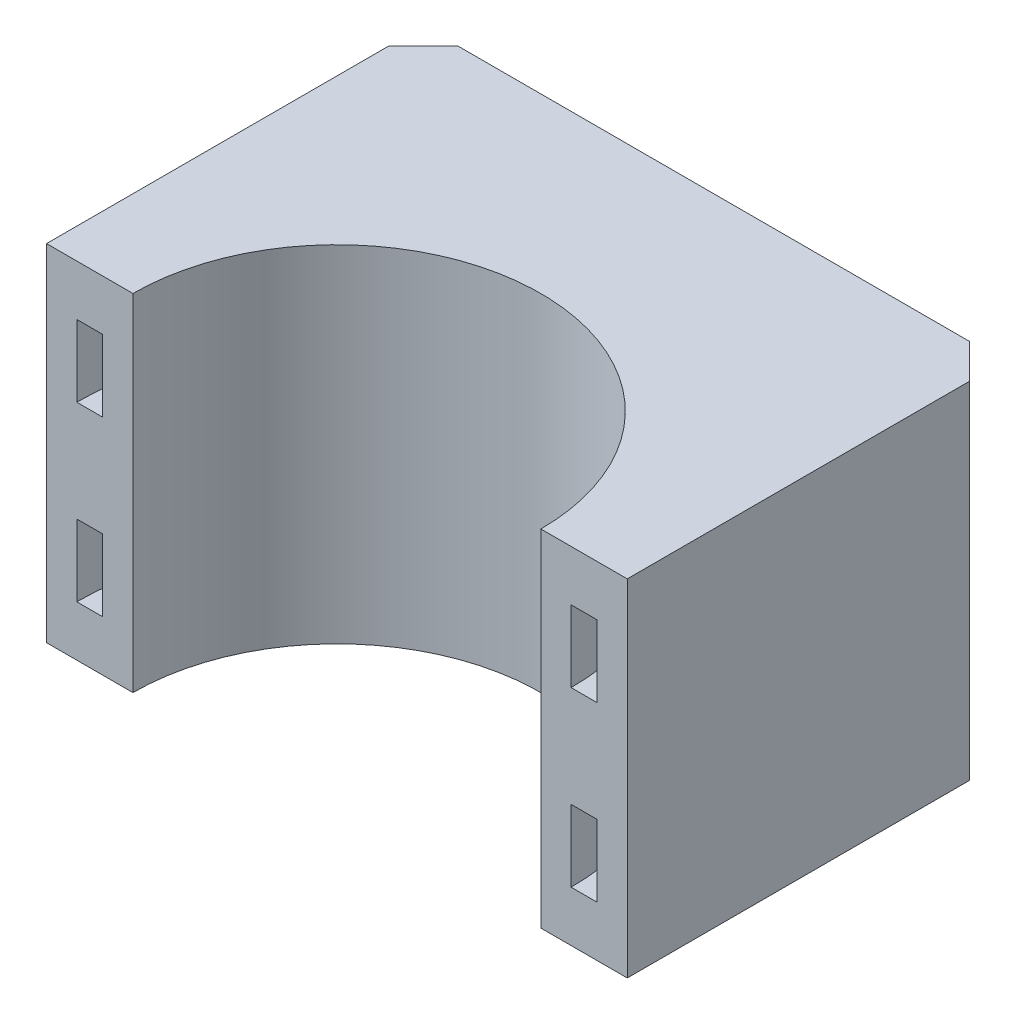
ISO-10303-21;
HEADER;
FILE_DESCRIPTION(('STEP AP214'),'2;1');
FILE_NAME('part.step','',(''),(''),'','','');
FILE_SCHEMA(('AUTOMOTIVE_DESIGN { 1 0 10303 214 1 1 1 1 }'));
ENDSEC;
DATA;
#1=APPLICATION_CONTEXT('core data for automotive mechanical design processes');
#2=APPLICATION_PROTOCOL_DEFINITION('international standard','automotive_design',2000,#1);
#3=PRODUCT_CONTEXT('',#1,'mechanical');
#4=PRODUCT('Part','Part','',(#3));
#5=PRODUCT_RELATED_PRODUCT_CATEGORY('part','',(#4));
#6=PRODUCT_DEFINITION_FORMATION('','',#4);
#7=PRODUCT_DEFINITION_CONTEXT('part definition',#1,'design');
#8=PRODUCT_DEFINITION('design','',#6,#7);
#9=PRODUCT_DEFINITION_SHAPE('','',#8);
#10=(LENGTH_UNIT() NAMED_UNIT(*) SI_UNIT(.MILLI.,.METRE.));
#11=(NAMED_UNIT(*) PLANE_ANGLE_UNIT() SI_UNIT($,.RADIAN.));
#12=(NAMED_UNIT(*) SI_UNIT($,.STERADIAN.) SOLID_ANGLE_UNIT());
#13=UNCERTAINTY_MEASURE_WITH_UNIT(LENGTH_MEASURE(1.E-05),#10,'distance_accuracy_value','');
#14=(GEOMETRIC_REPRESENTATION_CONTEXT(3) GLOBAL_UNCERTAINTY_ASSIGNED_CONTEXT((#13)) GLOBAL_UNIT_ASSIGNED_CONTEXT((#10,
#11,#12)) REPRESENTATION_CONTEXT('',''));
#15=CARTESIAN_POINT('',(0.,0.,0.));
#16=DIRECTION('',(0.,0.,1.));
#17=DIRECTION('',(1.,0.,0.));
#18=AXIS2_PLACEMENT_3D('',#15,#16,#17);
#19=CARTESIAN_POINT('',(-16.8,10.,-21.8));
#20=DIRECTION('',(0.,0.,1.));
#21=DIRECTION('',(1.,0.,0.));
#22=AXIS2_PLACEMENT_3D('',#19,#20,#21);
#23=PLANE('',#22);
#24=CARTESIAN_POINT('',(0.,0.,-21.8));
#25=DIRECTION('',(0.,0.,-1.));
#26=DIRECTION('',(-1.,0.,0.));
#27=AXIS2_PLACEMENT_3D('',#24,#25,#26);
#28=CIRCLE('',#27,1.25);
#29=CARTESIAN_POINT('',(-1.25,0.,-21.8));
#30=VERTEX_POINT('',#29);
#31=EDGE_CURVE('E181',#30,#30,#28,.T.);
#32=ORIENTED_EDGE('',*,*,#31,.F.);
#33=EDGE_LOOP('',(#32));
#34=FACE_BOUND('',#33,.T.);
#35=CARTESIAN_POINT('',(-11.8,5.,-21.8));
#36=DIRECTION('',(0.,0.,-1.));
#37=DIRECTION('',(-1.,0.,0.));
#38=AXIS2_PLACEMENT_3D('',#35,#36,#37);
#39=CIRCLE('',#38,1.25);
#40=CARTESIAN_POINT('',(-13.05,5.,-21.8));
#41=VERTEX_POINT('',#40);
#42=EDGE_CURVE('E191',#41,#41,#39,.T.);
#43=ORIENTED_EDGE('',*,*,#42,.F.);
#44=EDGE_LOOP('',(#43));
#45=FACE_BOUND('',#44,.T.);
#46=CARTESIAN_POINT('',(11.8,5.,-21.8));
#47=DIRECTION('',(0.,0.,-1.));
#48=DIRECTION('',(-1.,0.,0.));
#49=AXIS2_PLACEMENT_3D('',#46,#47,#48);
#50=CIRCLE('',#49,1.25);
#51=CARTESIAN_POINT('',(10.55,5.,-21.8));
#52=VERTEX_POINT('',#51);
#53=EDGE_CURVE('E197',#52,#52,#50,.T.);
#54=ORIENTED_EDGE('',*,*,#53,.F.);
#55=EDGE_LOOP('',(#54));
#56=FACE_BOUND('',#55,.T.);
#57=CARTESIAN_POINT('',(11.8,-5.,-21.8));
#58=DIRECTION('',(0.,0.,-1.));
#59=DIRECTION('',(-1.,0.,0.));
#60=AXIS2_PLACEMENT_3D('',#57,#58,#59);
#61=CIRCLE('',#60,1.25);
#62=CARTESIAN_POINT('',(10.55,-5.,-21.8));
#63=VERTEX_POINT('',#62);
#64=EDGE_CURVE('E203',#63,#63,#61,.T.);
#65=ORIENTED_EDGE('',*,*,#64,.F.);
#66=EDGE_LOOP('',(#65));
#67=FACE_BOUND('',#66,.T.);
#68=DIRECTION('',(-1.,0.,0.));
#69=VECTOR('',#68,1.);
#70=CARTESIAN_POINT('',(-16.8,-10.,-21.8));
#71=LINE('',#70,#69);
#72=CARTESIAN_POINT('',(14.8,-10.,-21.8));
#73=VERTEX_POINT('',#72);
#74=CARTESIAN_POINT('',(-14.8,-10.,-21.8));
#75=VERTEX_POINT('',#74);
#76=EDGE_CURVE('E271',#73,#75,#71,.T.);
#77=ORIENTED_EDGE('',*,*,#76,.T.);
#78=DIRECTION('',(0.,1.,0.));
#79=VECTOR('',#78,1.);
#80=CARTESIAN_POINT('',(-14.8,10.,-21.8));
#81=LINE('',#80,#79);
#82=CARTESIAN_POINT('',(-14.8,10.,-21.8));
#83=VERTEX_POINT('',#82);
#84=EDGE_CURVE('E63',#75,#83,#81,.T.);
#85=ORIENTED_EDGE('',*,*,#84,.T.);
#86=DIRECTION('',(-1.,0.,0.));
#87=VECTOR('',#86,1.);
#88=CARTESIAN_POINT('',(-16.8,10.,-21.8));
#89=LINE('',#88,#87);
#90=CARTESIAN_POINT('',(14.8,10.,-21.8));
#91=VERTEX_POINT('',#90);
#92=EDGE_CURVE('E258',#91,#83,#89,.T.);
#93=ORIENTED_EDGE('',*,*,#92,.F.);
#94=DIRECTION('',(0.,-1.,0.));
#95=VECTOR('',#94,1.);
#96=CARTESIAN_POINT('',(14.8,10.,-21.8));
#97=LINE('',#96,#95);
#98=EDGE_CURVE('E312',#91,#73,#97,.T.);
#99=ORIENTED_EDGE('',*,*,#98,.T.);
#100=EDGE_LOOP('',(#77,#85,#93,#99));
#101=FACE_BOUND('',#100,.T.);
#102=CARTESIAN_POINT('',(-11.8,-5.,-21.8));
#103=DIRECTION('',(0.,0.,-1.));
#104=DIRECTION('',(-1.,0.,0.));
#105=AXIS2_PLACEMENT_3D('',#102,#103,#104);
#106=CIRCLE('',#105,1.25);
#107=CARTESIAN_POINT('',(-13.05,-5.,-21.8));
#108=VERTEX_POINT('',#107);
#109=EDGE_CURVE('E180',#108,#108,#106,.T.);
#110=ORIENTED_EDGE('',*,*,#109,.F.);
#111=EDGE_LOOP('',(#110));
#112=FACE_BOUND('',#111,.T.);
#113=ADVANCED_FACE('F41',(#34,#45,#56,#67,#101,#112),#23,.F.);
#114=CARTESIAN_POINT('',(16.8,10.,0.));
#115=DIRECTION('',(0.,0.,-1.));
#116=DIRECTION('',(-1.,0.,0.));
#117=AXIS2_PLACEMENT_3D('',#114,#115,#116);
#118=PLANE('',#117);
#119=DIRECTION('',(0.,1.,0.));
#120=VECTOR('',#119,1.);
#121=CARTESIAN_POINT('',(15.05,0.,0.));
#122=LINE('',#121,#120);
#123=CARTESIAN_POINT('',(15.05,-7.075,0.));
#124=VERTEX_POINT('',#123);
#125=CARTESIAN_POINT('',(15.05,-2.925,0.));
#126=VERTEX_POINT('',#125);
#127=EDGE_CURVE('E238',#124,#126,#122,.T.);
#128=ORIENTED_EDGE('',*,*,#127,.F.);
#129=DIRECTION('',(1.,0.,0.));
#130=VECTOR('',#129,1.);
#131=CARTESIAN_POINT('',(16.8,-7.075,0.));
#132=LINE('',#131,#130);
#133=CARTESIAN_POINT('',(13.55,-7.075,0.));
#134=VERTEX_POINT('',#133);
#135=EDGE_CURVE('E222',#134,#124,#132,.T.);
#136=ORIENTED_EDGE('',*,*,#135,.F.);
#137=DIRECTION('',(0.,1.,0.));
#138=VECTOR('',#137,1.);
#139=CARTESIAN_POINT('',(13.55,0.,0.));
#140=LINE('',#139,#138);
#141=CARTESIAN_POINT('',(13.55,-2.925,0.));
#142=VERTEX_POINT('',#141);
#143=EDGE_CURVE('E233',#142,#134,#140,.F.);
#144=ORIENTED_EDGE('',*,*,#143,.F.);
#145=DIRECTION('',(-1.,0.,0.));
#146=VECTOR('',#145,1.);
#147=CARTESIAN_POINT('',(16.8,-2.925,0.));
#148=LINE('',#147,#146);
#149=EDGE_CURVE('E236',#126,#142,#148,.T.);
#150=ORIENTED_EDGE('',*,*,#149,.F.);
#151=EDGE_LOOP('',(#128,#136,#144,#150));
#152=FACE_BOUND('',#151,.T.);
#153=DIRECTION('',(1.,0.,0.));
#154=VECTOR('',#153,1.);
#155=CARTESIAN_POINT('',(16.8,-10.,0.));
#156=LINE('',#155,#154);
#157=CARTESIAN_POINT('',(11.8,-10.,0.));
#158=VERTEX_POINT('',#157);
#159=CARTESIAN_POINT('',(16.8,-10.,0.));
#160=VERTEX_POINT('',#159);
#161=EDGE_CURVE('E267',#158,#160,#156,.T.);
#162=ORIENTED_EDGE('',*,*,#161,.T.);
#163=DIRECTION('',(0.,-1.,0.));
#164=VECTOR('',#163,1.);
#165=CARTESIAN_POINT('',(16.8,10.,0.));
#166=LINE('',#165,#164);
#167=CARTESIAN_POINT('',(16.8,10.,0.));
#168=VERTEX_POINT('',#167);
#169=EDGE_CURVE('E281',#168,#160,#166,.T.);
#170=ORIENTED_EDGE('',*,*,#169,.F.);
#171=DIRECTION('',(1.,0.,0.));
#172=VECTOR('',#171,1.);
#173=CARTESIAN_POINT('',(16.8,10.,0.));
#174=LINE('',#173,#172);
#175=CARTESIAN_POINT('',(11.8,10.,0.));
#176=VERTEX_POINT('',#175);
#177=EDGE_CURVE('E253',#176,#168,#174,.T.);
#178=ORIENTED_EDGE('',*,*,#177,.F.);
#179=DIRECTION('',(0.,-1.,0.));
#180=VECTOR('',#179,1.);
#181=CARTESIAN_POINT('',(11.8,10.,0.));
#182=LINE('',#181,#180);
#183=EDGE_CURVE('E284',#176,#158,#182,.T.);
#184=ORIENTED_EDGE('',*,*,#183,.T.);
#185=EDGE_LOOP('',(#162,#170,#178,#184));
#186=FACE_BOUND('',#185,.T.);
#187=DIRECTION('',(0.,1.,0.));
#188=VECTOR('',#187,1.);
#189=CARTESIAN_POINT('',(15.05,0.,0.));
#190=LINE('',#189,#188);
#191=CARTESIAN_POINT('',(15.05,2.925,0.));
#192=VERTEX_POINT('',#191);
#193=CARTESIAN_POINT('',(15.05,7.075,0.));
#194=VERTEX_POINT('',#193);
#195=EDGE_CURVE('E247',#192,#194,#190,.T.);
#196=ORIENTED_EDGE('',*,*,#195,.F.);
#197=DIRECTION('',(1.,0.,0.));
#198=VECTOR('',#197,1.);
#199=CARTESIAN_POINT('',(16.8,2.925,0.));
#200=LINE('',#199,#198);
#201=CARTESIAN_POINT('',(13.55,2.925,0.));
#202=VERTEX_POINT('',#201);
#203=EDGE_CURVE('E240',#202,#192,#200,.T.);
#204=ORIENTED_EDGE('',*,*,#203,.F.);
#205=DIRECTION('',(0.,1.,0.));
#206=VECTOR('',#205,1.);
#207=CARTESIAN_POINT('',(13.55,0.,0.));
#208=LINE('',#207,#206);
#209=CARTESIAN_POINT('',(13.55,7.075,0.));
#210=VERTEX_POINT('',#209);
#211=EDGE_CURVE('E242',#210,#202,#208,.F.);
#212=ORIENTED_EDGE('',*,*,#211,.F.);
#213=DIRECTION('',(-1.,0.,0.));
#214=VECTOR('',#213,1.);
#215=CARTESIAN_POINT('',(16.8,7.075,0.));
#216=LINE('',#215,#214);
#217=EDGE_CURVE('E245',#194,#210,#216,.T.);
#218=ORIENTED_EDGE('',*,*,#217,.F.);
#219=EDGE_LOOP('',(#196,#204,#212,#218));
#220=FACE_BOUND('',#219,.T.);
#221=ADVANCED_FACE('F341',(#152,#186,#220),#118,.F.);
#222=CARTESIAN_POINT('',(-11.8,10.,0.));
#223=DIRECTION('',(0.,0.,-1.));
#224=DIRECTION('',(-1.,0.,0.));
#225=AXIS2_PLACEMENT_3D('',#222,#223,#224);
#226=PLANE('',#225);
#227=DIRECTION('',(0.,1.,0.));
#228=VECTOR('',#227,1.);
#229=CARTESIAN_POINT('',(-15.05,0.,0.));
#230=LINE('',#229,#228);
#231=CARTESIAN_POINT('',(-15.05,-2.925,0.));
#232=VERTEX_POINT('',#231);
#233=CARTESIAN_POINT('',(-15.05,-7.075,0.));
#234=VERTEX_POINT('',#233);
#235=EDGE_CURVE('E293',#232,#234,#230,.F.);
#236=ORIENTED_EDGE('',*,*,#235,.F.);
#237=DIRECTION('',(-1.,0.,0.));
#238=VECTOR('',#237,1.);
#239=CARTESIAN_POINT('',(-11.8,-2.925,0.));
#240=LINE('',#239,#238);
#241=CARTESIAN_POINT('',(-13.55,-2.925,0.));
#242=VERTEX_POINT('',#241);
#243=EDGE_CURVE('E291',#242,#232,#240,.T.);
#244=ORIENTED_EDGE('',*,*,#243,.F.);
#245=DIRECTION('',(0.,1.,0.));
#246=VECTOR('',#245,1.);
#247=CARTESIAN_POINT('',(-13.55,0.,0.));
#248=LINE('',#247,#246);
#249=CARTESIAN_POINT('',(-13.55,-7.075,0.));
#250=VERTEX_POINT('',#249);
#251=EDGE_CURVE('E289',#250,#242,#248,.T.);
#252=ORIENTED_EDGE('',*,*,#251,.F.);
#253=DIRECTION('',(1.,0.,0.));
#254=VECTOR('',#253,1.);
#255=CARTESIAN_POINT('',(-11.8,-7.075,0.));
#256=LINE('',#255,#254);
#257=EDGE_CURVE('E287',#234,#250,#256,.T.);
#258=ORIENTED_EDGE('',*,*,#257,.F.);
#259=EDGE_LOOP('',(#236,#244,#252,#258));
#260=FACE_BOUND('',#259,.T.);
#261=DIRECTION('',(1.,0.,0.));
#262=VECTOR('',#261,1.);
#263=CARTESIAN_POINT('',(-11.8,-10.,0.));
#264=LINE('',#263,#262);
#265=CARTESIAN_POINT('',(-16.8,-10.,0.));
#266=VERTEX_POINT('',#265);
#267=CARTESIAN_POINT('',(-11.8,-10.,0.));
#268=VERTEX_POINT('',#267);
#269=EDGE_CURVE('E254',#266,#268,#264,.T.);
#270=ORIENTED_EDGE('',*,*,#269,.T.);
#271=DIRECTION('',(0.,-1.,0.));
#272=VECTOR('',#271,1.);
#273=CARTESIAN_POINT('',(-11.8,10.,0.));
#274=LINE('',#273,#272);
#275=CARTESIAN_POINT('',(-11.8,10.,0.));
#276=VERTEX_POINT('',#275);
#277=EDGE_CURVE('E264',#276,#268,#274,.T.);
#278=ORIENTED_EDGE('',*,*,#277,.F.);
#279=DIRECTION('',(1.,0.,0.));
#280=VECTOR('',#279,1.);
#281=CARTESIAN_POINT('',(-11.8,10.,0.));
#282=LINE('',#281,#280);
#283=CARTESIAN_POINT('',(-16.8,10.,0.));
#284=VERTEX_POINT('',#283);
#285=EDGE_CURVE('E262',#284,#276,#282,.T.);
#286=ORIENTED_EDGE('',*,*,#285,.F.);
#287=DIRECTION('',(0.,-1.,0.));
#288=VECTOR('',#287,1.);
#289=CARTESIAN_POINT('',(-16.8,10.,0.));
#290=LINE('',#289,#288);
#291=EDGE_CURVE('E278',#284,#266,#290,.T.);
#292=ORIENTED_EDGE('',*,*,#291,.T.);
#293=EDGE_LOOP('',(#270,#278,#286,#292));
#294=FACE_BOUND('',#293,.T.);
#295=DIRECTION('',(0.,1.,0.));
#296=VECTOR('',#295,1.);
#297=CARTESIAN_POINT('',(-15.05,0.,0.));
#298=LINE('',#297,#296);
#299=CARTESIAN_POINT('',(-15.05,7.075,0.));
#300=VERTEX_POINT('',#299);
#301=CARTESIAN_POINT('',(-15.05,2.925,0.));
#302=VERTEX_POINT('',#301);
#303=EDGE_CURVE('E302',#300,#302,#298,.F.);
#304=ORIENTED_EDGE('',*,*,#303,.F.);
#305=DIRECTION('',(-1.,0.,0.));
#306=VECTOR('',#305,1.);
#307=CARTESIAN_POINT('',(-11.8,7.075,0.));
#308=LINE('',#307,#306);
#309=CARTESIAN_POINT('',(-13.55,7.075,0.));
#310=VERTEX_POINT('',#309);
#311=EDGE_CURVE('E300',#310,#300,#308,.T.);
#312=ORIENTED_EDGE('',*,*,#311,.F.);
#313=DIRECTION('',(0.,1.,0.));
#314=VECTOR('',#313,1.);
#315=CARTESIAN_POINT('',(-13.55,0.,0.));
#316=LINE('',#315,#314);
#317=CARTESIAN_POINT('',(-13.55,2.925,0.));
#318=VERTEX_POINT('',#317);
#319=EDGE_CURVE('E298',#318,#310,#316,.T.);
#320=ORIENTED_EDGE('',*,*,#319,.F.);
#321=DIRECTION('',(1.,0.,0.));
#322=VECTOR('',#321,1.);
#323=CARTESIAN_POINT('',(-11.8,2.925,0.));
#324=LINE('',#323,#322);
#325=EDGE_CURVE('E296',#302,#318,#324,.T.);
#326=ORIENTED_EDGE('',*,*,#325,.F.);
#327=EDGE_LOOP('',(#304,#312,#320,#326));
#328=FACE_BOUND('',#327,.T.);
#329=ADVANCED_FACE('F350',(#260,#294,#328),#226,.F.);
#330=CARTESIAN_POINT('',(0.,10.,0.));
#331=DIRECTION('',(0.,-1.,0.));
#332=DIRECTION('',(0.,0.,-1.));
#333=AXIS2_PLACEMENT_3D('',#330,#331,#332);
#334=CYLINDRICAL_SURFACE('',#333,11.8);
#335=CARTESIAN_POINT('',(0.,-10.,0.));
#336=DIRECTION('',(0.,-1.,0.));
#337=DIRECTION('',(0.,0.,1.));
#338=AXIS2_PLACEMENT_3D('',#335,#336,#337);
#339=CIRCLE('',#338,11.8);
#340=EDGE_CURVE('E249',#268,#158,#339,.T.);
#341=ORIENTED_EDGE('',*,*,#340,.T.);
#342=ORIENTED_EDGE('',*,*,#183,.F.);
#343=CARTESIAN_POINT('',(0.,10.,0.));
#344=DIRECTION('',(0.,-1.,0.));
#345=DIRECTION('',(0.,0.,1.));
#346=AXIS2_PLACEMENT_3D('',#343,#344,#345);
#347=CIRCLE('',#346,11.8);
#348=EDGE_CURVE('E250',#276,#176,#347,.T.);
#349=ORIENTED_EDGE('',*,*,#348,.F.);
#350=ORIENTED_EDGE('',*,*,#277,.T.);
#351=EDGE_LOOP('',(#341,#342,#349,#350));
#352=FACE_BOUND('',#351,.T.);
#353=ADVANCED_FACE('F346',(#352),#334,.F.);
#354=CARTESIAN_POINT('',(16.8,10.,-21.8));
#355=DIRECTION('',(-1.,0.,0.));
#356=DIRECTION('',(0.,0.,1.));
#357=AXIS2_PLACEMENT_3D('',#354,#355,#356);
#358=PLANE('',#357);
#359=DIRECTION('',(0.,0.,-1.));
#360=VECTOR('',#359,1.);
#361=CARTESIAN_POINT('',(16.8,-10.,-21.8));
#362=LINE('',#361,#360);
#363=CARTESIAN_POINT('',(16.8,-10.,-19.8));
#364=VERTEX_POINT('',#363);
#365=EDGE_CURVE('E269',#160,#364,#362,.T.);
#366=ORIENTED_EDGE('',*,*,#365,.T.);
#367=DIRECTION('',(0.,1.,0.));
#368=VECTOR('',#367,1.);
#369=CARTESIAN_POINT('',(16.8,10.,-19.8));
#370=LINE('',#369,#368);
#371=CARTESIAN_POINT('',(16.8,10.,-19.8));
#372=VERTEX_POINT('',#371);
#373=EDGE_CURVE('E11',#364,#372,#370,.T.);
#374=ORIENTED_EDGE('',*,*,#373,.T.);
#375=DIRECTION('',(0.,0.,-1.));
#376=VECTOR('',#375,1.);
#377=CARTESIAN_POINT('',(16.8,10.,-21.8));
#378=LINE('',#377,#376);
#379=EDGE_CURVE('E256',#168,#372,#378,.T.);
#380=ORIENTED_EDGE('',*,*,#379,.F.);
#381=ORIENTED_EDGE('',*,*,#169,.T.);
#382=EDGE_LOOP('',(#366,#374,#380,#381));
#383=FACE_BOUND('',#382,.T.);
#384=ADVANCED_FACE('F338',(#383),#358,.F.);
#385=CARTESIAN_POINT('',(-16.8,10.,0.));
#386=DIRECTION('',(1.,0.,0.));
#387=DIRECTION('',(0.,0.,-1.));
#388=AXIS2_PLACEMENT_3D('',#385,#386,#387);
#389=PLANE('',#388);
#390=DIRECTION('',(0.,0.,1.));
#391=VECTOR('',#390,1.);
#392=CARTESIAN_POINT('',(-16.8,10.,0.));
#393=LINE('',#392,#391);
#394=CARTESIAN_POINT('',(-16.8,10.,-19.8));
#395=VERTEX_POINT('',#394);
#396=EDGE_CURVE('E260',#395,#284,#393,.T.);
#397=ORIENTED_EDGE('',*,*,#396,.F.);
#398=DIRECTION('',(0.,-1.,0.));
#399=VECTOR('',#398,1.);
#400=CARTESIAN_POINT('',(-16.8,10.,-19.8));
#401=LINE('',#400,#399);
#402=CARTESIAN_POINT('',(-16.8,-10.,-19.8));
#403=VERTEX_POINT('',#402);
#404=EDGE_CURVE('E305',#395,#403,#401,.T.);
#405=ORIENTED_EDGE('',*,*,#404,.T.);
#406=DIRECTION('',(0.,0.,1.));
#407=VECTOR('',#406,1.);
#408=CARTESIAN_POINT('',(-16.8,-10.,0.));
#409=LINE('',#408,#407);
#410=EDGE_CURVE('E273',#403,#266,#409,.T.);
#411=ORIENTED_EDGE('',*,*,#410,.T.);
#412=ORIENTED_EDGE('',*,*,#291,.F.);
#413=EDGE_LOOP('',(#397,#405,#411,#412));
#414=FACE_BOUND('',#413,.T.);
#415=ADVANCED_FACE('F325',(#414),#389,.F.);
#416=CARTESIAN_POINT('',(0.,10.,0.));
#417=DIRECTION('',(0.,1.,0.));
#418=DIRECTION('',(0.,0.,1.));
#419=AXIS2_PLACEMENT_3D('',#416,#417,#418);
#420=PLANE('',#419);
#421=ORIENTED_EDGE('',*,*,#92,.T.);
#422=DIRECTION('',(0.707106781186549,0.,-0.707106781186546));
#423=VECTOR('',#422,1.);
#424=CARTESIAN_POINT('',(-18.3,10.,-18.3));
#425=LINE('',#424,#423);
#426=EDGE_CURVE('E50',#83,#395,#425,.F.);
#427=ORIENTED_EDGE('',*,*,#426,.T.);
#428=ORIENTED_EDGE('',*,*,#396,.T.);
#429=ORIENTED_EDGE('',*,*,#285,.T.);
#430=ORIENTED_EDGE('',*,*,#348,.T.);
#431=ORIENTED_EDGE('',*,*,#177,.T.);
#432=ORIENTED_EDGE('',*,*,#379,.T.);
#433=DIRECTION('',(0.707106781186546,0.,0.707106781186549));
#434=VECTOR('',#433,1.);
#435=CARTESIAN_POINT('',(18.3,10.,-18.3));
#436=LINE('',#435,#434);
#437=EDGE_CURVE('E316',#372,#91,#436,.F.);
#438=ORIENTED_EDGE('',*,*,#437,.T.);
#439=EDGE_LOOP('',(#421,#427,#428,#429,#430,#431,#432,#438));
#440=FACE_BOUND('',#439,.T.);
#441=ADVANCED_FACE('F320',(#440),#420,.T.);
#442=CARTESIAN_POINT('',(0.,-10.,0.));
#443=DIRECTION('',(0.,1.,0.));
#444=DIRECTION('',(0.,0.,1.));
#445=AXIS2_PLACEMENT_3D('',#442,#443,#444);
#446=PLANE('',#445);
#447=ORIENTED_EDGE('',*,*,#410,.F.);
#448=DIRECTION('',(-0.707106781186549,0.,0.707106781186546));
#449=VECTOR('',#448,1.);
#450=CARTESIAN_POINT('',(-16.8,-10.,-19.8));
#451=LINE('',#450,#449);
#452=EDGE_CURVE('E310',#403,#75,#451,.F.);
#453=ORIENTED_EDGE('',*,*,#452,.T.);
#454=ORIENTED_EDGE('',*,*,#76,.F.);
#455=DIRECTION('',(-0.707106781186546,0.,-0.707106781186549));
#456=VECTOR('',#455,1.);
#457=CARTESIAN_POINT('',(14.8,-10.,-21.8));
#458=LINE('',#457,#456);
#459=EDGE_CURVE('E308',#73,#364,#458,.F.);
#460=ORIENTED_EDGE('',*,*,#459,.T.);
#461=ORIENTED_EDGE('',*,*,#365,.F.);
#462=ORIENTED_EDGE('',*,*,#161,.F.);
#463=ORIENTED_EDGE('',*,*,#340,.F.);
#464=ORIENTED_EDGE('',*,*,#269,.F.);
#465=EDGE_LOOP('',(#447,#453,#454,#460,#461,#462,#463,#464));
#466=FACE_BOUND('',#465,.T.);
#467=ADVANCED_FACE('F331',(#466),#446,.F.);
#468=CARTESIAN_POINT('',(0.,0.,0.));
#469=DIRECTION('',(0.,1.,0.));
#470=DIRECTION('',(0.,0.,1.));
#471=AXIS2_PLACEMENT_3D('',#468,#469,#470);
#472=CYLINDRICAL_SURFACE('',#471,15.05);
#473=ORIENTED_EDGE('',*,*,#127,.T.);
#474=CARTESIAN_POINT('',(0.,-2.925,0.));
#475=DIRECTION('',(0.,1.,0.));
#476=DIRECTION('',(0.,0.,1.));
#477=AXIS2_PLACEMENT_3D('',#474,#475,#476);
#478=CIRCLE('',#477,15.05);
#479=EDGE_CURVE('E213',#126,#232,#478,.T.);
#480=ORIENTED_EDGE('',*,*,#479,.T.);
#481=ORIENTED_EDGE('',*,*,#235,.T.);
#482=CARTESIAN_POINT('',(0.,-7.075,0.));
#483=DIRECTION('',(0.,1.,0.));
#484=DIRECTION('',(0.,0.,1.));
#485=AXIS2_PLACEMENT_3D('',#482,#483,#484);
#486=CIRCLE('',#485,15.05);
#487=EDGE_CURVE('E209',#124,#234,#486,.T.);
#488=ORIENTED_EDGE('',*,*,#487,.F.);
#489=EDGE_LOOP('',(#473,#480,#481,#488));
#490=FACE_BOUND('',#489,.T.);
#491=ADVANCED_FACE('F563',(#490),#472,.F.);
#492=CARTESIAN_POINT('',(13.55,-2.925,0.));
#493=DIRECTION('',(0.,-1.,0.));
#494=DIRECTION('',(0.,0.,-1.));
#495=AXIS2_PLACEMENT_3D('',#492,#493,#494);
#496=PLANE('',#495);
#497=ORIENTED_EDGE('',*,*,#149,.T.);
#498=CARTESIAN_POINT('',(0.,-2.925,0.));
#499=DIRECTION('',(0.,1.,0.));
#500=DIRECTION('',(0.,0.,1.));
#501=AXIS2_PLACEMENT_3D('',#498,#499,#500);
#502=CIRCLE('',#501,13.55);
#503=EDGE_CURVE('E227',#142,#242,#502,.T.);
#504=ORIENTED_EDGE('',*,*,#503,.T.);
#505=ORIENTED_EDGE('',*,*,#243,.T.);
#506=ORIENTED_EDGE('',*,*,#479,.F.);
#507=EDGE_LOOP('',(#497,#504,#505,#506));
#508=FACE_BOUND('',#507,.T.);
#509=ADVANCED_FACE('F554',(#508),#496,.T.);
#510=CARTESIAN_POINT('',(0.,0.,0.));
#511=DIRECTION('',(0.,1.,0.));
#512=DIRECTION('',(0.,0.,1.));
#513=AXIS2_PLACEMENT_3D('',#510,#511,#512);
#514=CYLINDRICAL_SURFACE('',#513,13.55);
#515=ORIENTED_EDGE('',*,*,#143,.T.);
#516=CARTESIAN_POINT('',(0.,-7.075,0.));
#517=DIRECTION('',(0.,1.,0.));
#518=DIRECTION('',(0.,0.,1.));
#519=AXIS2_PLACEMENT_3D('',#516,#517,#518);
#520=CIRCLE('',#519,13.55);
#521=EDGE_CURVE('E224',#134,#250,#520,.T.);
#522=ORIENTED_EDGE('',*,*,#521,.T.);
#523=ORIENTED_EDGE('',*,*,#251,.T.);
#524=ORIENTED_EDGE('',*,*,#503,.F.);
#525=EDGE_LOOP('',(#515,#522,#523,#524));
#526=FACE_BOUND('',#525,.T.);
#527=ADVANCED_FACE('F545',(#526),#514,.T.);
#528=CARTESIAN_POINT('',(13.55,-7.075,0.));
#529=DIRECTION('',(0.,1.,0.));
#530=DIRECTION('',(0.,0.,1.));
#531=AXIS2_PLACEMENT_3D('',#528,#529,#530);
#532=PLANE('',#531);
#533=ORIENTED_EDGE('',*,*,#135,.T.);
#534=ORIENTED_EDGE('',*,*,#487,.T.);
#535=ORIENTED_EDGE('',*,*,#257,.T.);
#536=ORIENTED_EDGE('',*,*,#521,.F.);
#537=EDGE_LOOP('',(#533,#534,#535,#536));
#538=FACE_BOUND('',#537,.T.);
#539=ADVANCED_FACE('F537',(#538),#532,.T.);
#540=CARTESIAN_POINT('',(0.,0.,0.));
#541=DIRECTION('',(0.,1.,0.));
#542=DIRECTION('',(0.,0.,1.));
#543=AXIS2_PLACEMENT_3D('',#540,#541,#542);
#544=CYLINDRICAL_SURFACE('',#543,15.05);
#545=ORIENTED_EDGE('',*,*,#195,.T.);
#546=CARTESIAN_POINT('',(0.,7.075,0.));
#547=DIRECTION('',(0.,1.,0.));
#548=DIRECTION('',(0.,0.,1.));
#549=AXIS2_PLACEMENT_3D('',#546,#547,#548);
#550=CIRCLE('',#549,15.05);
#551=EDGE_CURVE('E219',#194,#300,#550,.T.);
#552=ORIENTED_EDGE('',*,*,#551,.T.);
#553=ORIENTED_EDGE('',*,*,#303,.T.);
#554=CARTESIAN_POINT('',(0.,2.925,0.));
#555=DIRECTION('',(0.,1.,0.));
#556=DIRECTION('',(0.,0.,1.));
#557=AXIS2_PLACEMENT_3D('',#554,#555,#556);
#558=CIRCLE('',#557,15.05);
#559=EDGE_CURVE('E210',#192,#302,#558,.T.);
#560=ORIENTED_EDGE('',*,*,#559,.F.);
#561=EDGE_LOOP('',(#545,#552,#553,#560));
#562=FACE_BOUND('',#561,.T.);
#563=ADVANCED_FACE('F361',(#562),#544,.F.);
#564=CARTESIAN_POINT('',(13.55,7.075,0.));
#565=DIRECTION('',(0.,-1.,0.));
#566=DIRECTION('',(0.,0.,-1.));
#567=AXIS2_PLACEMENT_3D('',#564,#565,#566);
#568=PLANE('',#567);
#569=ORIENTED_EDGE('',*,*,#217,.T.);
#570=CARTESIAN_POINT('',(0.,7.075,0.));
#571=DIRECTION('',(0.,1.,0.));
#572=DIRECTION('',(0.,0.,1.));
#573=AXIS2_PLACEMENT_3D('',#570,#571,#572);
#574=CIRCLE('',#573,13.55);
#575=EDGE_CURVE('E216',#210,#310,#574,.T.);
#576=ORIENTED_EDGE('',*,*,#575,.T.);
#577=ORIENTED_EDGE('',*,*,#311,.T.);
#578=ORIENTED_EDGE('',*,*,#551,.F.);
#579=EDGE_LOOP('',(#569,#576,#577,#578));
#580=FACE_BOUND('',#579,.T.);
#581=ADVANCED_FACE('F366',(#580),#568,.T.);
#582=CARTESIAN_POINT('',(0.,0.,0.));
#583=DIRECTION('',(0.,1.,0.));
#584=DIRECTION('',(0.,0.,1.));
#585=AXIS2_PLACEMENT_3D('',#582,#583,#584);
#586=CYLINDRICAL_SURFACE('',#585,13.55);
#587=ORIENTED_EDGE('',*,*,#211,.T.);
#588=CARTESIAN_POINT('',(0.,2.925,0.));
#589=DIRECTION('',(0.,1.,0.));
#590=DIRECTION('',(0.,0.,1.));
#591=AXIS2_PLACEMENT_3D('',#588,#589,#590);
#592=CIRCLE('',#591,13.55);
#593=EDGE_CURVE('E212',#202,#318,#592,.T.);
#594=ORIENTED_EDGE('',*,*,#593,.T.);
#595=ORIENTED_EDGE('',*,*,#319,.T.);
#596=ORIENTED_EDGE('',*,*,#575,.F.);
#597=EDGE_LOOP('',(#587,#594,#595,#596));
#598=FACE_BOUND('',#597,.T.);
#599=ADVANCED_FACE('F371',(#598),#586,.T.);
#600=CARTESIAN_POINT('',(13.55,2.925,0.));
#601=DIRECTION('',(0.,1.,0.));
#602=DIRECTION('',(0.,0.,1.));
#603=AXIS2_PLACEMENT_3D('',#600,#601,#602);
#604=PLANE('',#603);
#605=ORIENTED_EDGE('',*,*,#203,.T.);
#606=ORIENTED_EDGE('',*,*,#559,.T.);
#607=ORIENTED_EDGE('',*,*,#325,.T.);
#608=ORIENTED_EDGE('',*,*,#593,.F.);
#609=EDGE_LOOP('',(#605,#606,#607,#608));
#610=FACE_BOUND('',#609,.T.);
#611=ADVANCED_FACE('F373',(#610),#604,.T.);
#612=CARTESIAN_POINT('',(11.8,-5.,-13.5510757737844));
#613=DIRECTION('',(0.,0.,-1.));
#614=DIRECTION('',(-1.,0.,0.));
#615=AXIS2_PLACEMENT_3D('',#612,#613,#614);
#616=CONICAL_SURFACE('',#615,1.25,1.02974425867665);
#617=CARTESIAN_POINT('',(11.8,-5.,-12.8));
#618=VERTEX_POINT('',#617);
#619=VERTEX_LOOP('',#618);
#620=FACE_BOUND('',#619,.T.);
#621=CARTESIAN_POINT('',(11.8,-5.,-13.5510757737844));
#622=DIRECTION('',(0.,0.,-1.));
#623=DIRECTION('',(-1.,0.,0.));
#624=AXIS2_PLACEMENT_3D('',#621,#622,#623);
#625=CIRCLE('',#624,1.25);
#626=CARTESIAN_POINT('',(10.55,-5.,-13.5510757737844));
#627=VERTEX_POINT('',#626);
#628=EDGE_CURVE('E206',#627,#627,#625,.T.);
#629=ORIENTED_EDGE('',*,*,#628,.T.);
#630=EDGE_LOOP('',(#629));
#631=FACE_BOUND('',#630,.T.);
#632=ADVANCED_FACE('F375',(#620,#631),#616,.F.);
#633=CARTESIAN_POINT('',(11.8,-5.,-21.8));
#634=DIRECTION('',(0.,0.,-1.));
#635=DIRECTION('',(-1.,0.,0.));
#636=AXIS2_PLACEMENT_3D('',#633,#634,#635);
#637=CYLINDRICAL_SURFACE('',#636,1.25);
#638=ORIENTED_EDGE('',*,*,#628,.F.);
#639=EDGE_LOOP('',(#638));
#640=FACE_BOUND('',#639,.T.);
#641=ORIENTED_EDGE('',*,*,#64,.T.);
#642=EDGE_LOOP('',(#641));
#643=FACE_BOUND('',#642,.T.);
#644=ADVANCED_FACE('F381',(#640,#643),#637,.F.);
#645=CARTESIAN_POINT('',(11.8,5.,-13.5510757737844));
#646=DIRECTION('',(0.,0.,-1.));
#647=DIRECTION('',(-1.,0.,0.));
#648=AXIS2_PLACEMENT_3D('',#645,#646,#647);
#649=CONICAL_SURFACE('',#648,1.25,1.02974425867665);
#650=CARTESIAN_POINT('',(11.8,5.,-12.8));
#651=VERTEX_POINT('',#650);
#652=VERTEX_LOOP('',#651);
#653=FACE_BOUND('',#652,.T.);
#654=CARTESIAN_POINT('',(11.8,5.,-13.5510757737844));
#655=DIRECTION('',(0.,0.,-1.));
#656=DIRECTION('',(-1.,0.,0.));
#657=AXIS2_PLACEMENT_3D('',#654,#655,#656);
#658=CIRCLE('',#657,1.25);
#659=CARTESIAN_POINT('',(10.55,5.,-13.5510757737844));
#660=VERTEX_POINT('',#659);
#661=EDGE_CURVE('E200',#660,#660,#658,.T.);
#662=ORIENTED_EDGE('',*,*,#661,.T.);
#663=EDGE_LOOP('',(#662));
#664=FACE_BOUND('',#663,.T.);
#665=ADVANCED_FACE('F432',(#653,#664),#649,.F.);
#666=CARTESIAN_POINT('',(11.8,5.,-21.8));
#667=DIRECTION('',(0.,0.,-1.));
#668=DIRECTION('',(-1.,0.,0.));
#669=AXIS2_PLACEMENT_3D('',#666,#667,#668);
#670=CYLINDRICAL_SURFACE('',#669,1.25);
#671=ORIENTED_EDGE('',*,*,#661,.F.);
#672=EDGE_LOOP('',(#671));
#673=FACE_BOUND('',#672,.T.);
#674=ORIENTED_EDGE('',*,*,#53,.T.);
#675=EDGE_LOOP('',(#674));
#676=FACE_BOUND('',#675,.T.);
#677=ADVANCED_FACE('F428',(#673,#676),#670,.F.);
#678=CARTESIAN_POINT('',(-11.8,5.,-13.5510757737844));
#679=DIRECTION('',(0.,0.,-1.));
#680=DIRECTION('',(-1.,0.,0.));
#681=AXIS2_PLACEMENT_3D('',#678,#679,#680);
#682=CONICAL_SURFACE('',#681,1.25,1.02974425867665);
#683=CARTESIAN_POINT('',(-11.8,5.,-12.8));
#684=VERTEX_POINT('',#683);
#685=VERTEX_LOOP('',#684);
#686=FACE_BOUND('',#685,.T.);
#687=CARTESIAN_POINT('',(-11.8,5.,-13.5510757737844));
#688=DIRECTION('',(0.,0.,-1.));
#689=DIRECTION('',(-1.,0.,0.));
#690=AXIS2_PLACEMENT_3D('',#687,#688,#689);
#691=CIRCLE('',#690,1.25);
#692=CARTESIAN_POINT('',(-13.05,5.,-13.5510757737844));
#693=VERTEX_POINT('',#692);
#694=EDGE_CURVE('E194',#693,#693,#691,.T.);
#695=ORIENTED_EDGE('',*,*,#694,.T.);
#696=EDGE_LOOP('',(#695));
#697=FACE_BOUND('',#696,.T.);
#698=ADVANCED_FACE('F424',(#686,#697),#682,.F.);
#699=CARTESIAN_POINT('',(-11.8,5.,-21.8));
#700=DIRECTION('',(0.,0.,-1.));
#701=DIRECTION('',(-1.,0.,0.));
#702=AXIS2_PLACEMENT_3D('',#699,#700,#701);
#703=CYLINDRICAL_SURFACE('',#702,1.25);
#704=ORIENTED_EDGE('',*,*,#694,.F.);
#705=EDGE_LOOP('',(#704));
#706=FACE_BOUND('',#705,.T.);
#707=ORIENTED_EDGE('',*,*,#42,.T.);
#708=EDGE_LOOP('',(#707));
#709=FACE_BOUND('',#708,.T.);
#710=ADVANCED_FACE('F420',(#706,#709),#703,.F.);
#711=CARTESIAN_POINT('',(-11.8,-5.,-13.5510757737844));
#712=DIRECTION('',(0.,0.,-1.));
#713=DIRECTION('',(-1.,0.,0.));
#714=AXIS2_PLACEMENT_3D('',#711,#712,#713);
#715=CONICAL_SURFACE('',#714,1.25,1.02974425867665);
#716=CARTESIAN_POINT('',(-11.8,-5.,-12.8));
#717=VERTEX_POINT('',#716);
#718=VERTEX_LOOP('',#717);
#719=FACE_BOUND('',#718,.T.);
#720=CARTESIAN_POINT('',(-11.8,-5.,-13.5510757737844));
#721=DIRECTION('',(0.,0.,-1.));
#722=DIRECTION('',(-1.,0.,0.));
#723=AXIS2_PLACEMENT_3D('',#720,#721,#722);
#724=CIRCLE('',#723,1.25);
#725=CARTESIAN_POINT('',(-13.05,-5.,-13.5510757737844));
#726=VERTEX_POINT('',#725);
#727=EDGE_CURVE('E184',#726,#726,#724,.T.);
#728=ORIENTED_EDGE('',*,*,#727,.T.);
#729=EDGE_LOOP('',(#728));
#730=FACE_BOUND('',#729,.T.);
#731=ADVANCED_FACE('F416',(#719,#730),#715,.F.);
#732=CARTESIAN_POINT('',(-11.8,-5.,-21.8));
#733=DIRECTION('',(0.,0.,-1.));
#734=DIRECTION('',(-1.,0.,0.));
#735=AXIS2_PLACEMENT_3D('',#732,#733,#734);
#736=CYLINDRICAL_SURFACE('',#735,1.25);
#737=ORIENTED_EDGE('',*,*,#727,.F.);
#738=EDGE_LOOP('',(#737));
#739=FACE_BOUND('',#738,.T.);
#740=ORIENTED_EDGE('',*,*,#109,.T.);
#741=EDGE_LOOP('',(#740));
#742=FACE_BOUND('',#741,.T.);
#743=ADVANCED_FACE('F174',(#739,#742),#736,.F.);
#744=CARTESIAN_POINT('',(0.,0.,-13.5510757737844));
#745=DIRECTION('',(0.,0.,-1.));
#746=DIRECTION('',(-1.,0.,0.));
#747=AXIS2_PLACEMENT_3D('',#744,#745,#746);
#748=CONICAL_SURFACE('',#747,1.25,1.02974425867665);
#749=CARTESIAN_POINT('',(0.,0.,-12.8));
#750=VERTEX_POINT('',#749);
#751=VERTEX_LOOP('',#750);
#752=FACE_BOUND('',#751,.T.);
#753=CARTESIAN_POINT('',(0.,0.,-13.5510757737844));
#754=DIRECTION('',(0.,0.,-1.));
#755=DIRECTION('',(-1.,0.,0.));
#756=AXIS2_PLACEMENT_3D('',#753,#754,#755);
#757=CIRCLE('',#756,1.25);
#758=CARTESIAN_POINT('',(-1.25,0.,-13.5510757737844));
#759=VERTEX_POINT('',#758);
#760=EDGE_CURVE('E178',#759,#759,#757,.T.);
#761=ORIENTED_EDGE('',*,*,#760,.T.);
#762=EDGE_LOOP('',(#761));
#763=FACE_BOUND('',#762,.T.);
#764=ADVANCED_FACE('F170',(#752,#763),#748,.F.);
#765=CARTESIAN_POINT('',(0.,0.,-21.8));
#766=DIRECTION('',(0.,0.,-1.));
#767=DIRECTION('',(-1.,0.,0.));
#768=AXIS2_PLACEMENT_3D('',#765,#766,#767);
#769=CYLINDRICAL_SURFACE('',#768,1.25);
#770=ORIENTED_EDGE('',*,*,#760,.F.);
#771=EDGE_LOOP('',(#770));
#772=FACE_BOUND('',#771,.T.);
#773=ORIENTED_EDGE('',*,*,#31,.T.);
#774=EDGE_LOOP('',(#773));
#775=FACE_BOUND('',#774,.T.);
#776=ADVANCED_FACE('F173',(#772,#775),#769,.F.);
#777=CARTESIAN_POINT('',(-16.8,10.,-19.8));
#778=DIRECTION('',(0.707106781186546,0.,0.707106781186549));
#779=DIRECTION('',(0.,-1.,0.));
#780=AXIS2_PLACEMENT_3D('',#777,#778,#779);
#781=PLANE('',#780);
#782=ORIENTED_EDGE('',*,*,#426,.F.);
#783=ORIENTED_EDGE('',*,*,#84,.F.);
#784=ORIENTED_EDGE('',*,*,#452,.F.);
#785=ORIENTED_EDGE('',*,*,#404,.F.);
#786=EDGE_LOOP('',(#782,#783,#784,#785));
#787=FACE_BOUND('',#786,.T.);
#788=ADVANCED_FACE('F328',(#787),#781,.F.);
#789=CARTESIAN_POINT('',(14.8,10.,-21.8));
#790=DIRECTION('',(-0.707106781186549,0.,0.707106781186546));
#791=DIRECTION('',(0.,-1.,0.));
#792=AXIS2_PLACEMENT_3D('',#789,#790,#791);
#793=PLANE('',#792);
#794=ORIENTED_EDGE('',*,*,#437,.F.);
#795=ORIENTED_EDGE('',*,*,#373,.F.);
#796=ORIENTED_EDGE('',*,*,#459,.F.);
#797=ORIENTED_EDGE('',*,*,#98,.F.);
#798=EDGE_LOOP('',(#794,#795,#796,#797));
#799=FACE_BOUND('',#798,.T.);
#800=ADVANCED_FACE('F44',(#799),#793,.F.);
#801=CLOSED_SHELL('',(#113,#221,#329,#353,#384,#415,#441,#467,#491,#509,#527,#539,#563,#581,
#599,#611,#632,#644,#665,#677,#698,#710,#731,#743,#764,#776,#788,#800));
#802=MANIFOLD_SOLID_BREP('B2',#801);
#803=ADVANCED_BREP_SHAPE_REPRESENTATION('',(#18,#802),#14);
#804=SHAPE_DEFINITION_REPRESENTATION(#9,#803);
ENDSEC;
END-ISO-10303-21;
